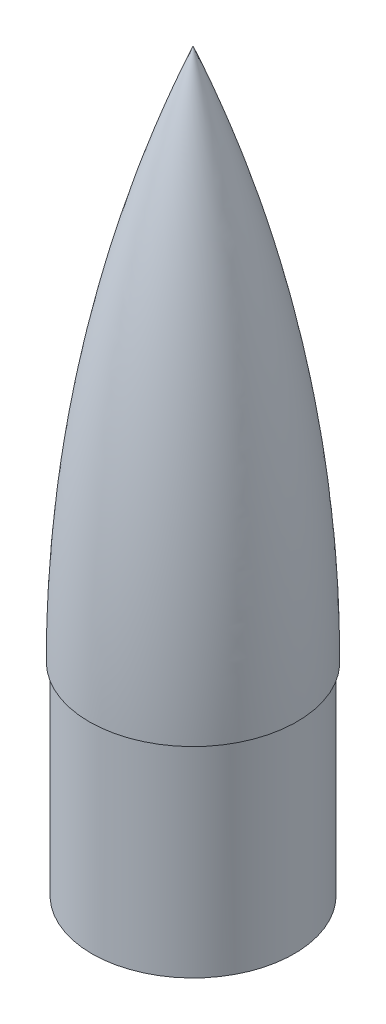
ISO-10303-21;
HEADER;
FILE_DESCRIPTION(('STEP AP214'),'2;1');
FILE_NAME('part.step','',(''),(''),'','','');
FILE_SCHEMA(('AUTOMOTIVE_DESIGN { 1 0 10303 214 1 1 1 1 }'));
ENDSEC;
DATA;
#1=APPLICATION_CONTEXT('core data for automotive mechanical design processes');
#2=APPLICATION_PROTOCOL_DEFINITION('international standard','automotive_design',2000,#1);
#3=PRODUCT_CONTEXT('',#1,'mechanical');
#4=PRODUCT('Part','Part','',(#3));
#5=PRODUCT_RELATED_PRODUCT_CATEGORY('part','',(#4));
#6=PRODUCT_DEFINITION_FORMATION('','',#4);
#7=PRODUCT_DEFINITION_CONTEXT('part definition',#1,'design');
#8=PRODUCT_DEFINITION('design','',#6,#7);
#9=PRODUCT_DEFINITION_SHAPE('','',#8);
#10=(LENGTH_UNIT() NAMED_UNIT(*) SI_UNIT(.MILLI.,.METRE.));
#11=(NAMED_UNIT(*) PLANE_ANGLE_UNIT() SI_UNIT($,.RADIAN.));
#12=(NAMED_UNIT(*) SI_UNIT($,.STERADIAN.) SOLID_ANGLE_UNIT());
#13=UNCERTAINTY_MEASURE_WITH_UNIT(LENGTH_MEASURE(1.E-05),#10,'distance_accuracy_value','');
#14=(GEOMETRIC_REPRESENTATION_CONTEXT(3) GLOBAL_UNCERTAINTY_ASSIGNED_CONTEXT((#13)) GLOBAL_UNIT_ASSIGNED_CONTEXT((#10,
#11,#12)) REPRESENTATION_CONTEXT('',''));
#15=CARTESIAN_POINT('',(0.,0.,0.));
#16=DIRECTION('',(0.,0.,1.));
#17=DIRECTION('',(1.,0.,0.));
#18=AXIS2_PLACEMENT_3D('',#15,#16,#17);
#19=CARTESIAN_POINT('',(0.,0.,-993.420310811265));
#20=DIRECTION('',(-1.,0.,0.));
#21=DIRECTION('',(0.,0.,1.));
#22=AXIS2_PLACEMENT_3D('',#19,#20,#21);
#23=CIRCLE('',#22,1071.62031081127);
#24=TRIMMED_CURVE('',#23,(PARAMETER_VALUE(-0.384392556962875)),
(PARAMETER_VALUE(0.384392556962875)),.T.,.PARAMETER.);
#25=CARTESIAN_POINT('',(0.,0.,0.));
#26=DIRECTION('',(0.,1.,0.));
#27=AXIS1_PLACEMENT('',#25,#26);
#28=SURFACE_OF_REVOLUTION('',#24,#27);
#29=CARTESIAN_POINT('',(0.,401.853426775089,0.));
#30=VERTEX_POINT('',#29);
#31=VERTEX_LOOP('',#30);
#32=FACE_BOUND('',#31,.T.);
#33=CARTESIAN_POINT('',(0.,0.,0.));
#34=DIRECTION('',(0.,1.,0.));
#35=DIRECTION('',(0.,0.,1.));
#36=AXIS2_PLACEMENT_3D('',#33,#34,#35);
#37=CIRCLE('',#36,78.2);
#38=CARTESIAN_POINT('',(0.,0.,78.2));
#39=VERTEX_POINT('',#38);
#40=EDGE_CURVE('E44',#39,#39,#37,.T.);
#41=ORIENTED_EDGE('',*,*,#40,.T.);
#42=EDGE_LOOP('',(#41));
#43=FACE_BOUND('',#42,.T.);
#44=ADVANCED_FACE('F37',(#32,#43),#28,.T.);
#45=CARTESIAN_POINT('',(78.2,0.,0.));
#46=DIRECTION('',(0.,-1.,0.));
#47=DIRECTION('',(0.,0.,-1.));
#48=AXIS2_PLACEMENT_3D('',#45,#46,#47);
#49=PLANE('',#48);
#50=CARTESIAN_POINT('',(0.,0.,0.));
#51=DIRECTION('',(0.,-1.,0.));
#52=DIRECTION('',(0.,0.,-1.));
#53=AXIS2_PLACEMENT_3D('',#50,#51,#52);
#54=CIRCLE('',#53,76.2);
#55=CARTESIAN_POINT('',(0.,0.,-76.2));
#56=VERTEX_POINT('',#55);
#57=EDGE_CURVE('E56',#56,#56,#54,.F.);
#58=ORIENTED_EDGE('',*,*,#57,.T.);
#59=EDGE_LOOP('',(#58));
#60=FACE_BOUND('',#59,.T.);
#61=ORIENTED_EDGE('',*,*,#40,.F.);
#62=EDGE_LOOP('',(#61));
#63=FACE_BOUND('',#62,.T.);
#64=ADVANCED_FACE('F52',(#60,#63),#49,.T.);
#65=CARTESIAN_POINT('',(0.,10.,0.));
#66=DIRECTION('',(0.,1.,0.));
#67=DIRECTION('',(0.,0.,1.));
#68=AXIS2_PLACEMENT_3D('',#65,#66,#67);
#69=PLANE('',#68);
#70=CARTESIAN_POINT('',(0.,10.,0.));
#71=DIRECTION('',(0.,1.,0.));
#72=DIRECTION('',(0.,0.,1.));
#73=AXIS2_PLACEMENT_3D('',#70,#71,#72);
#74=CIRCLE('',#73,74.2);
#75=CARTESIAN_POINT('',(0.,10.,74.2));
#76=VERTEX_POINT('',#75);
#77=EDGE_CURVE('E58',#76,#76,#74,.T.);
#78=ORIENTED_EDGE('',*,*,#77,.F.);
#79=EDGE_LOOP('',(#78));
#80=FACE_BOUND('',#79,.T.);
#81=CARTESIAN_POINT('',(0.,10.,0.));
#82=DIRECTION('',(0.,1.,0.));
#83=DIRECTION('',(0.,0.,1.));
#84=AXIS2_PLACEMENT_3D('',#81,#82,#83);
#85=CIRCLE('',#84,76.1532534188851);
#86=CARTESIAN_POINT('',(0.,10.,76.1532534188851));
#87=VERTEX_POINT('',#86);
#88=EDGE_CURVE('E11',#87,#87,#85,.T.);
#89=ORIENTED_EDGE('',*,*,#88,.T.);
#90=EDGE_LOOP('',(#89));
#91=FACE_BOUND('',#90,.T.);
#92=ADVANCED_FACE('F84',(#80,#91),#69,.T.);
#93=CARTESIAN_POINT('',(0.,10.,0.));
#94=DIRECTION('',(0.,-1.,0.));
#95=DIRECTION('',(0.,0.,-1.));
#96=AXIS2_PLACEMENT_3D('',#93,#94,#95);
#97=CYLINDRICAL_SURFACE('',#96,76.2);
#98=ORIENTED_EDGE('',*,*,#57,.F.);
#99=EDGE_LOOP('',(#98));
#100=FACE_BOUND('',#99,.T.);
#101=CARTESIAN_POINT('',(0.,-152.4,0.));
#102=DIRECTION('',(0.,1.,0.));
#103=DIRECTION('',(0.,0.,1.));
#104=AXIS2_PLACEMENT_3D('',#101,#102,#103);
#105=CIRCLE('',#104,76.2);
#106=CARTESIAN_POINT('',(0.,-152.4,76.2));
#107=VERTEX_POINT('',#106);
#108=EDGE_CURVE('E63',#107,#107,#105,.T.);
#109=ORIENTED_EDGE('',*,*,#108,.T.);
#110=EDGE_LOOP('',(#109));
#111=FACE_BOUND('',#110,.T.);
#112=ADVANCED_FACE('F75',(#100,#111),#97,.T.);
#113=CARTESIAN_POINT('',(0.,10.,0.));
#114=DIRECTION('',(0.,-1.,0.));
#115=DIRECTION('',(0.,0.,-1.));
#116=AXIS2_PLACEMENT_3D('',#113,#114,#115);
#117=CYLINDRICAL_SURFACE('',#116,74.2);
#118=ORIENTED_EDGE('',*,*,#77,.T.);
#119=EDGE_LOOP('',(#118));
#120=FACE_BOUND('',#119,.T.);
#121=CARTESIAN_POINT('',(0.,-152.4,0.));
#122=DIRECTION('',(0.,1.,0.));
#123=DIRECTION('',(0.,0.,1.));
#124=AXIS2_PLACEMENT_3D('',#121,#122,#123);
#125=CIRCLE('',#124,74.2);
#126=CARTESIAN_POINT('',(0.,-152.4,74.2));
#127=VERTEX_POINT('',#126);
#128=EDGE_CURVE('E66',#127,#127,#125,.T.);
#129=ORIENTED_EDGE('',*,*,#128,.F.);
#130=EDGE_LOOP('',(#129));
#131=FACE_BOUND('',#130,.T.);
#132=ADVANCED_FACE('F73',(#120,#131),#117,.F.);
#133=CARTESIAN_POINT('',(0.,-152.4,0.));
#134=DIRECTION('',(0.,1.,0.));
#135=DIRECTION('',(0.,0.,1.));
#136=AXIS2_PLACEMENT_3D('',#133,#134,#135);
#137=PLANE('',#136);
#138=ORIENTED_EDGE('',*,*,#128,.T.);
#139=EDGE_LOOP('',(#138));
#140=FACE_BOUND('',#139,.T.);
#141=ORIENTED_EDGE('',*,*,#108,.F.);
#142=EDGE_LOOP('',(#141));
#143=FACE_BOUND('',#142,.T.);
#144=ADVANCED_FACE('F70',(#140,#143),#137,.F.);
#145=CARTESIAN_POINT('',(0.,0.,-993.420310811265));
#146=DIRECTION('',(-1.,0.,0.));
#147=DIRECTION('',(0.,0.,1.));
#148=AXIS2_PLACEMENT_3D('',#145,#146,#147);
#149=CIRCLE('',#148,1069.62031081127);
#150=TRIMMED_CURVE('',#149,(PARAMETER_VALUE(-0.379743443275763)),
(PARAMETER_VALUE(0.379743443275763)),.T.,.PARAMETER.);
#151=CARTESIAN_POINT('',(0.,0.,0.));
#152=DIRECTION('',(0.,1.,0.));
#153=AXIS1_PLACEMENT('',#151,#152);
#154=SURFACE_OF_REVOLUTION('',#150,#153);
#155=ORIENTED_EDGE('',*,*,#88,.F.);
#156=EDGE_LOOP('',(#155));
#157=FACE_BOUND('',#156,.T.);
#158=CARTESIAN_POINT('',(-3.33066907387547E-13,396.489212170568,0.));
#159=VERTEX_POINT('',#158);
#160=VERTEX_LOOP('',#159);
#161=FACE_BOUND('',#160,.T.);
#162=ADVANCED_FACE('F82',(#157,#161),#154,.F.);
#163=CLOSED_SHELL('',(#44,#64,#92,#112,#132,#144,#162));
#164=MANIFOLD_SOLID_BREP('B2',#163);
#165=ADVANCED_BREP_SHAPE_REPRESENTATION('',(#18,#164),#14);
#166=SHAPE_DEFINITION_REPRESENTATION(#9,#165);
ENDSEC;
END-ISO-10303-21;
